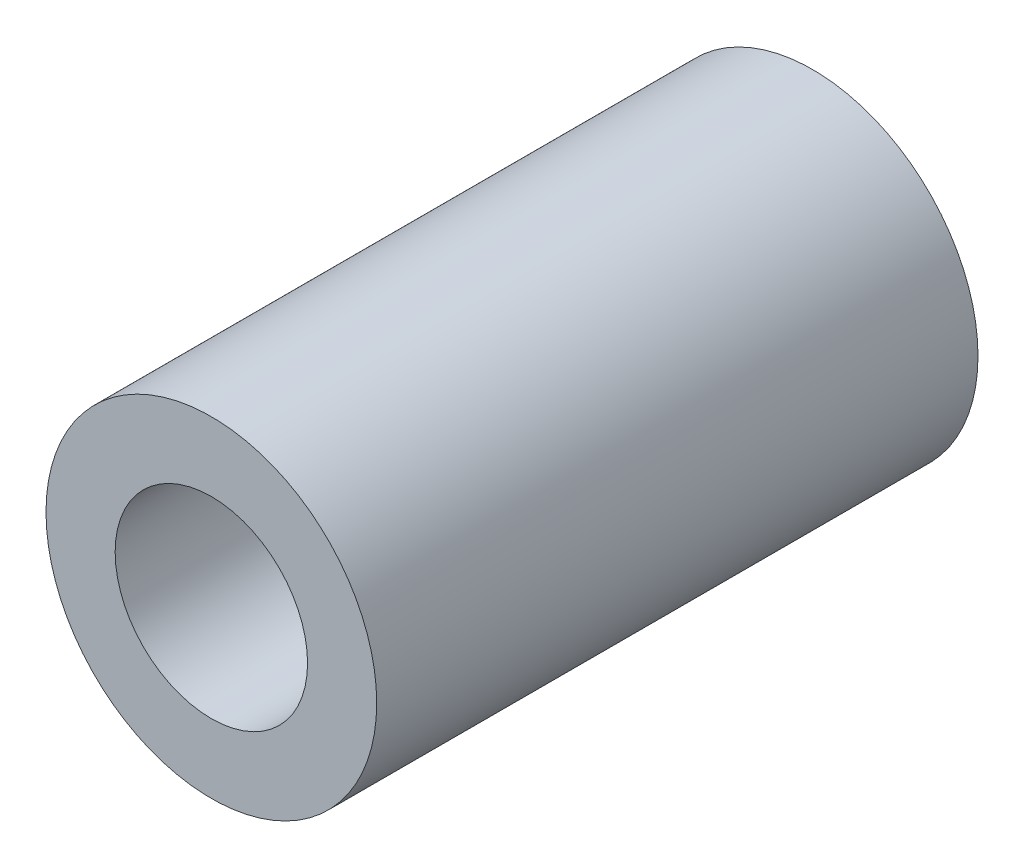
ISO-10303-21;
HEADER;
FILE_DESCRIPTION(('STEP AP214'),'2;1');
FILE_NAME('part.step','',(''),(''),'','','');
FILE_SCHEMA(('AUTOMOTIVE_DESIGN { 1 0 10303 214 1 1 1 1 }'));
ENDSEC;
DATA;
#1=APPLICATION_CONTEXT('core data for automotive mechanical design processes');
#2=APPLICATION_PROTOCOL_DEFINITION('international standard','automotive_design',2000,#1);
#3=PRODUCT_CONTEXT('',#1,'mechanical');
#4=PRODUCT('Part','Part','',(#3));
#5=PRODUCT_RELATED_PRODUCT_CATEGORY('part','',(#4));
#6=PRODUCT_DEFINITION_FORMATION('','',#4);
#7=PRODUCT_DEFINITION_CONTEXT('part definition',#1,'design');
#8=PRODUCT_DEFINITION('design','',#6,#7);
#9=PRODUCT_DEFINITION_SHAPE('','',#8);
#10=(LENGTH_UNIT() NAMED_UNIT(*) SI_UNIT(.MILLI.,.METRE.));
#11=(NAMED_UNIT(*) PLANE_ANGLE_UNIT() SI_UNIT($,.RADIAN.));
#12=(NAMED_UNIT(*) SI_UNIT($,.STERADIAN.) SOLID_ANGLE_UNIT());
#13=UNCERTAINTY_MEASURE_WITH_UNIT(LENGTH_MEASURE(1.E-05),#10,'distance_accuracy_value','');
#14=(GEOMETRIC_REPRESENTATION_CONTEXT(3) GLOBAL_UNCERTAINTY_ASSIGNED_CONTEXT((#13)) GLOBAL_UNIT_ASSIGNED_CONTEXT((#10,
#11,#12)) REPRESENTATION_CONTEXT('',''));
#15=CARTESIAN_POINT('',(0.,0.,0.));
#16=DIRECTION('',(0.,0.,1.));
#17=DIRECTION('',(1.,0.,0.));
#18=AXIS2_PLACEMENT_3D('',#15,#16,#17);
#19=CARTESIAN_POINT('',(0.,0.,10.));
#20=DIRECTION('',(0.,0.,1.));
#21=DIRECTION('',(1.,0.,0.));
#22=AXIS2_PLACEMENT_3D('',#19,#20,#21);
#23=PLANE('',#22);
#24=CARTESIAN_POINT('',(0.,0.,10.));
#25=DIRECTION('',(0.,0.,1.));
#26=DIRECTION('',(1.,0.,0.));
#27=AXIS2_PLACEMENT_3D('',#24,#25,#26);
#28=CIRCLE('',#27,2.75);
#29=CARTESIAN_POINT('',(2.75,0.,10.));
#30=VERTEX_POINT('',#29);
#31=EDGE_CURVE('E10',#30,#30,#28,.T.);
#32=ORIENTED_EDGE('',*,*,#31,.T.);
#33=EDGE_LOOP('',(#32));
#34=FACE_BOUND('',#33,.T.);
#35=CARTESIAN_POINT('',(0.,0.,10.));
#36=DIRECTION('',(0.,0.,1.));
#37=DIRECTION('',(1.,0.,0.));
#38=AXIS2_PLACEMENT_3D('',#35,#36,#37);
#39=CIRCLE('',#38,1.6);
#40=CARTESIAN_POINT('',(1.6,0.,10.));
#41=VERTEX_POINT('',#40);
#42=EDGE_CURVE('E46',#41,#41,#39,.T.);
#43=ORIENTED_EDGE('',*,*,#42,.F.);
#44=EDGE_LOOP('',(#43));
#45=FACE_BOUND('',#44,.T.);
#46=ADVANCED_FACE('F35',(#34,#45),#23,.T.);
#47=CARTESIAN_POINT('',(0.,0.,0.));
#48=DIRECTION('',(0.,0.,1.));
#49=DIRECTION('',(1.,0.,0.));
#50=AXIS2_PLACEMENT_3D('',#47,#48,#49);
#51=PLANE('',#50);
#52=CARTESIAN_POINT('',(0.,0.,0.));
#53=DIRECTION('',(0.,0.,1.));
#54=DIRECTION('',(1.,0.,0.));
#55=AXIS2_PLACEMENT_3D('',#52,#53,#54);
#56=CIRCLE('',#55,2.75);
#57=CARTESIAN_POINT('',(2.75,0.,0.));
#58=VERTEX_POINT('',#57);
#59=EDGE_CURVE('E39',#58,#58,#56,.T.);
#60=ORIENTED_EDGE('',*,*,#59,.F.);
#61=EDGE_LOOP('',(#60));
#62=FACE_BOUND('',#61,.T.);
#63=CARTESIAN_POINT('',(0.,0.,0.));
#64=DIRECTION('',(0.,0.,1.));
#65=DIRECTION('',(1.,0.,0.));
#66=AXIS2_PLACEMENT_3D('',#63,#64,#65);
#67=CIRCLE('',#66,1.6);
#68=CARTESIAN_POINT('',(1.6,0.,0.));
#69=VERTEX_POINT('',#68);
#70=EDGE_CURVE('E48',#69,#69,#67,.T.);
#71=ORIENTED_EDGE('',*,*,#70,.T.);
#72=EDGE_LOOP('',(#71));
#73=FACE_BOUND('',#72,.T.);
#74=ADVANCED_FACE('F58',(#62,#73),#51,.F.);
#75=CARTESIAN_POINT('',(0.,0.,10.));
#76=DIRECTION('',(0.,0.,-1.));
#77=DIRECTION('',(-1.,0.,0.));
#78=AXIS2_PLACEMENT_3D('',#75,#76,#77);
#79=CYLINDRICAL_SURFACE('',#78,2.75);
#80=ORIENTED_EDGE('',*,*,#31,.F.);
#81=EDGE_LOOP('',(#80));
#82=FACE_BOUND('',#81,.T.);
#83=ORIENTED_EDGE('',*,*,#59,.T.);
#84=EDGE_LOOP('',(#83));
#85=FACE_BOUND('',#84,.T.);
#86=ADVANCED_FACE('F37',(#82,#85),#79,.T.);
#87=CARTESIAN_POINT('',(0.,0.,10.));
#88=DIRECTION('',(0.,0.,-1.));
#89=DIRECTION('',(-1.,0.,0.));
#90=AXIS2_PLACEMENT_3D('',#87,#88,#89);
#91=CYLINDRICAL_SURFACE('',#90,1.6);
#92=ORIENTED_EDGE('',*,*,#42,.T.);
#93=EDGE_LOOP('',(#92));
#94=FACE_BOUND('',#93,.T.);
#95=ORIENTED_EDGE('',*,*,#70,.F.);
#96=EDGE_LOOP('',(#95));
#97=FACE_BOUND('',#96,.T.);
#98=ADVANCED_FACE('F54',(#94,#97),#91,.F.);
#99=CLOSED_SHELL('',(#46,#74,#86,#98));
#100=MANIFOLD_SOLID_BREP('B2',#99);
#101=ADVANCED_BREP_SHAPE_REPRESENTATION('',(#18,#100),#14);
#102=SHAPE_DEFINITION_REPRESENTATION(#9,#101);
ENDSEC;
END-ISO-10303-21;
